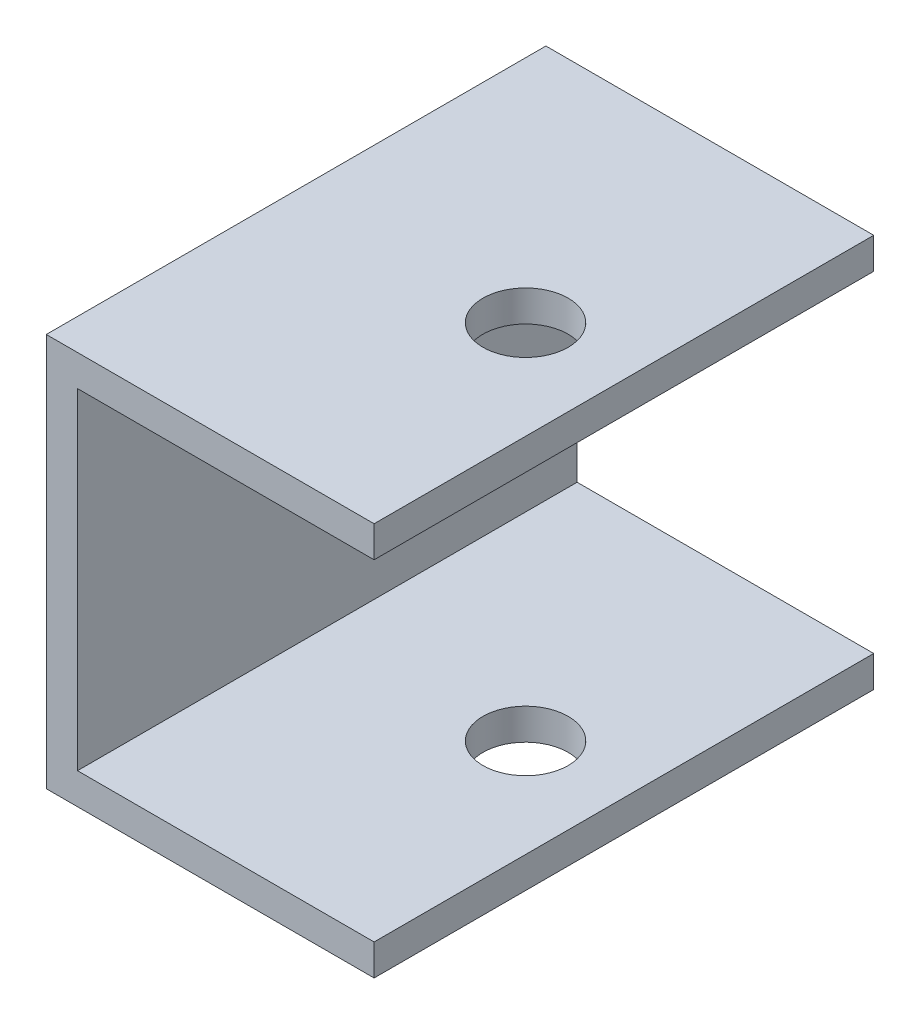
ISO-10303-21;
HEADER;
FILE_DESCRIPTION(('STEP AP214'),'2;1');
FILE_NAME('part.step','',(''),(''),'','','');
FILE_SCHEMA(('AUTOMOTIVE_DESIGN { 1 0 10303 214 1 1 1 1 }'));
ENDSEC;
DATA;
#1=APPLICATION_CONTEXT('core data for automotive mechanical design processes');
#2=APPLICATION_PROTOCOL_DEFINITION('international standard','automotive_design',2000,#1);
#3=PRODUCT_CONTEXT('',#1,'mechanical');
#4=PRODUCT('Part','Part','',(#3));
#5=PRODUCT_RELATED_PRODUCT_CATEGORY('part','',(#4));
#6=PRODUCT_DEFINITION_FORMATION('','',#4);
#7=PRODUCT_DEFINITION_CONTEXT('part definition',#1,'design');
#8=PRODUCT_DEFINITION('design','',#6,#7);
#9=PRODUCT_DEFINITION_SHAPE('','',#8);
#10=(LENGTH_UNIT() NAMED_UNIT(*) SI_UNIT(.MILLI.,.METRE.));
#11=(NAMED_UNIT(*) PLANE_ANGLE_UNIT() SI_UNIT($,.RADIAN.));
#12=(NAMED_UNIT(*) SI_UNIT($,.STERADIAN.) SOLID_ANGLE_UNIT());
#13=UNCERTAINTY_MEASURE_WITH_UNIT(LENGTH_MEASURE(1.E-05),#10,'distance_accuracy_value','');
#14=(GEOMETRIC_REPRESENTATION_CONTEXT(3) GLOBAL_UNCERTAINTY_ASSIGNED_CONTEXT((#13)) GLOBAL_UNIT_ASSIGNED_CONTEXT((#10,
#11,#12)) REPRESENTATION_CONTEXT('',''));
#15=CARTESIAN_POINT('',(0.,0.,0.));
#16=DIRECTION('',(0.,0.,1.));
#17=DIRECTION('',(1.,0.,0.));
#18=AXIS2_PLACEMENT_3D('',#15,#16,#17);
#19=CARTESIAN_POINT('',(45.2375,30.,38.1));
#20=DIRECTION('',(-1.,0.,0.));
#21=DIRECTION('',(0.,-1.,0.));
#22=AXIS2_PLACEMENT_3D('',#19,#20,#21);
#23=PLANE('',#22);
#24=DIRECTION('',(0.,1.,0.));
#25=VECTOR('',#24,1.);
#26=CARTESIAN_POINT('',(45.2375,30.,-38.1));
#27=LINE('',#26,#25);
#28=CARTESIAN_POINT('',(45.2375,25.2375,-38.1));
#29=VERTEX_POINT('',#28);
#30=CARTESIAN_POINT('',(45.2375,30.,-38.1));
#31=VERTEX_POINT('',#30);
#32=EDGE_CURVE('E142',#29,#31,#27,.T.);
#33=ORIENTED_EDGE('',*,*,#32,.T.);
#34=DIRECTION('',(0.,0.,-1.));
#35=VECTOR('',#34,1.);
#36=CARTESIAN_POINT('',(45.2375,30.,38.1));
#37=LINE('',#36,#35);
#38=CARTESIAN_POINT('',(45.2375,30.,38.1));
#39=VERTEX_POINT('',#38);
#40=EDGE_CURVE('E11',#39,#31,#37,.T.);
#41=ORIENTED_EDGE('',*,*,#40,.F.);
#42=DIRECTION('',(0.,1.,0.));
#43=VECTOR('',#42,1.);
#44=CARTESIAN_POINT('',(45.2375,30.,38.1));
#45=LINE('',#44,#43);
#46=CARTESIAN_POINT('',(45.2375,25.2375,38.1));
#47=VERTEX_POINT('',#46);
#48=EDGE_CURVE('E165',#47,#39,#45,.T.);
#49=ORIENTED_EDGE('',*,*,#48,.F.);
#50=DIRECTION('',(0.,0.,-1.));
#51=VECTOR('',#50,1.);
#52=CARTESIAN_POINT('',(45.2375,25.2375,38.1));
#53=LINE('',#52,#51);
#54=EDGE_CURVE('E138',#47,#29,#53,.T.);
#55=ORIENTED_EDGE('',*,*,#54,.T.);
#56=EDGE_LOOP('',(#33,#41,#49,#55));
#57=FACE_BOUND('',#56,.T.);
#58=ADVANCED_FACE('F39',(#57),#23,.F.);
#59=CARTESIAN_POINT('',(-4.7625,30.,38.1));
#60=DIRECTION('',(0.,-1.,0.));
#61=DIRECTION('',(0.,0.,-1.));
#62=AXIS2_PLACEMENT_3D('',#59,#60,#61);
#63=PLANE('',#62);
#64=CARTESIAN_POINT('',(30.2375,30.,0.));
#65=DIRECTION('',(0.,-1.,0.));
#66=DIRECTION('',(0.,0.,-1.));
#67=AXIS2_PLACEMENT_3D('',#64,#65,#66);
#68=CIRCLE('',#67,6.5);
#69=CARTESIAN_POINT('',(36.7375,30.,0.));
#70=VERTEX_POINT('',#69);
#71=EDGE_CURVE('E189',#70,#70,#68,.T.);
#72=ORIENTED_EDGE('',*,*,#71,.T.);
#73=EDGE_LOOP('',(#72));
#74=FACE_BOUND('',#73,.T.);
#75=DIRECTION('',(-1.,0.,0.));
#76=VECTOR('',#75,1.);
#77=CARTESIAN_POINT('',(-4.7625,30.,-38.1));
#78=LINE('',#77,#76);
#79=CARTESIAN_POINT('',(-4.7625,30.,-38.1));
#80=VERTEX_POINT('',#79);
#81=EDGE_CURVE('E146',#31,#80,#78,.T.);
#82=ORIENTED_EDGE('',*,*,#81,.T.);
#83=DIRECTION('',(0.,0.,-1.));
#84=VECTOR('',#83,1.);
#85=CARTESIAN_POINT('',(-4.7625,30.,38.1));
#86=LINE('',#85,#84);
#87=CARTESIAN_POINT('',(-4.7625,30.,38.1));
#88=VERTEX_POINT('',#87);
#89=EDGE_CURVE('E49',#88,#80,#86,.T.);
#90=ORIENTED_EDGE('',*,*,#89,.F.);
#91=DIRECTION('',(-1.,0.,0.));
#92=VECTOR('',#91,1.);
#93=CARTESIAN_POINT('',(-4.7625,30.,38.1));
#94=LINE('',#93,#92);
#95=EDGE_CURVE('E101',#39,#88,#94,.T.);
#96=ORIENTED_EDGE('',*,*,#95,.F.);
#97=ORIENTED_EDGE('',*,*,#40,.T.);
#98=EDGE_LOOP('',(#82,#90,#96,#97));
#99=FACE_BOUND('',#98,.T.);
#100=ADVANCED_FACE('F239',(#74,#99),#63,.F.);
#101=CARTESIAN_POINT('',(-4.7625,-30.,38.1));
#102=DIRECTION('',(1.,0.,0.));
#103=DIRECTION('',(0.,1.,0.));
#104=AXIS2_PLACEMENT_3D('',#101,#102,#103);
#105=PLANE('',#104);
#106=CARTESIAN_POINT('',(-4.7625,0.,0.));
#107=DIRECTION('',(-1.,0.,0.));
#108=DIRECTION('',(0.,-1.,0.));
#109=AXIS2_PLACEMENT_3D('',#106,#107,#108);
#110=CIRCLE('',#109,5.55625);
#111=CARTESIAN_POINT('',(-4.7625,-5.55625,0.));
#112=VERTEX_POINT('',#111);
#113=EDGE_CURVE('E184',#112,#112,#110,.T.);
#114=ORIENTED_EDGE('',*,*,#113,.F.);
#115=EDGE_LOOP('',(#114));
#116=FACE_BOUND('',#115,.T.);
#117=DIRECTION('',(0.,-1.,0.));
#118=VECTOR('',#117,1.);
#119=CARTESIAN_POINT('',(-4.7625,-30.,-38.1));
#120=LINE('',#119,#118);
#121=CARTESIAN_POINT('',(-4.7625,-30.,-38.1));
#122=VERTEX_POINT('',#121);
#123=EDGE_CURVE('E150',#80,#122,#120,.T.);
#124=ORIENTED_EDGE('',*,*,#123,.T.);
#125=DIRECTION('',(0.,0.,-1.));
#126=VECTOR('',#125,1.);
#127=CARTESIAN_POINT('',(-4.7625,-30.,38.1));
#128=LINE('',#127,#126);
#129=CARTESIAN_POINT('',(-4.7625,-30.,38.1));
#130=VERTEX_POINT('',#129);
#131=EDGE_CURVE('E176',#130,#122,#128,.T.);
#132=ORIENTED_EDGE('',*,*,#131,.F.);
#133=DIRECTION('',(0.,-1.,0.));
#134=VECTOR('',#133,1.);
#135=CARTESIAN_POINT('',(-4.7625,-30.,38.1));
#136=LINE('',#135,#134);
#137=EDGE_CURVE('E203',#88,#130,#136,.T.);
#138=ORIENTED_EDGE('',*,*,#137,.F.);
#139=ORIENTED_EDGE('',*,*,#89,.T.);
#140=EDGE_LOOP('',(#124,#132,#138,#139));
#141=FACE_BOUND('',#140,.T.);
#142=ADVANCED_FACE('F243',(#116,#141),#105,.F.);
#143=CARTESIAN_POINT('',(45.2375,-30.,38.1));
#144=DIRECTION('',(0.,1.,0.));
#145=DIRECTION('',(-1.,0.,0.));
#146=AXIS2_PLACEMENT_3D('',#143,#144,#145);
#147=PLANE('',#146);
#148=CARTESIAN_POINT('',(30.2375,-30.,0.));
#149=DIRECTION('',(0.,-1.,0.));
#150=DIRECTION('',(1.,0.,0.));
#151=AXIS2_PLACEMENT_3D('',#148,#149,#150);
#152=CIRCLE('',#151,6.5);
#153=CARTESIAN_POINT('',(36.7375,-30.,0.));
#154=VERTEX_POINT('',#153);
#155=EDGE_CURVE('E265',#154,#154,#152,.T.);
#156=ORIENTED_EDGE('',*,*,#155,.F.);
#157=EDGE_LOOP('',(#156));
#158=FACE_BOUND('',#157,.T.);
#159=DIRECTION('',(1.,0.,0.));
#160=VECTOR('',#159,1.);
#161=CARTESIAN_POINT('',(45.2375,-30.,-38.1));
#162=LINE('',#161,#160);
#163=CARTESIAN_POINT('',(45.2375,-30.,-38.1));
#164=VERTEX_POINT('',#163);
#165=EDGE_CURVE('E153',#122,#164,#162,.T.);
#166=ORIENTED_EDGE('',*,*,#165,.T.);
#167=DIRECTION('',(0.,0.,-1.));
#168=VECTOR('',#167,1.);
#169=CARTESIAN_POINT('',(45.2375,-30.,38.1));
#170=LINE('',#169,#168);
#171=CARTESIAN_POINT('',(45.2375,-30.,38.1));
#172=VERTEX_POINT('',#171);
#173=EDGE_CURVE('E172',#172,#164,#170,.T.);
#174=ORIENTED_EDGE('',*,*,#173,.F.);
#175=DIRECTION('',(1.,0.,0.));
#176=VECTOR('',#175,1.);
#177=CARTESIAN_POINT('',(45.2375,-30.,38.1));
#178=LINE('',#177,#176);
#179=EDGE_CURVE('E206',#130,#172,#178,.T.);
#180=ORIENTED_EDGE('',*,*,#179,.F.);
#181=ORIENTED_EDGE('',*,*,#131,.T.);
#182=EDGE_LOOP('',(#166,#174,#180,#181));
#183=FACE_BOUND('',#182,.T.);
#184=ADVANCED_FACE('F214',(#158,#183),#147,.F.);
#185=CARTESIAN_POINT('',(45.2375,-25.2375,38.1));
#186=DIRECTION('',(-1.,0.,0.));
#187=DIRECTION('',(0.,0.,1.));
#188=AXIS2_PLACEMENT_3D('',#185,#186,#187);
#189=PLANE('',#188);
#190=DIRECTION('',(0.,1.,0.));
#191=VECTOR('',#190,1.);
#192=CARTESIAN_POINT('',(45.2375,-25.2375,-38.1));
#193=LINE('',#192,#191);
#194=CARTESIAN_POINT('',(45.2375,-25.2375,-38.1));
#195=VERTEX_POINT('',#194);
#196=EDGE_CURVE('E156',#164,#195,#193,.T.);
#197=ORIENTED_EDGE('',*,*,#196,.T.);
#198=DIRECTION('',(0.,0.,-1.));
#199=VECTOR('',#198,1.);
#200=CARTESIAN_POINT('',(45.2375,-25.2375,38.1));
#201=LINE('',#200,#199);
#202=CARTESIAN_POINT('',(45.2375,-25.2375,38.1));
#203=VERTEX_POINT('',#202);
#204=EDGE_CURVE('E131',#203,#195,#201,.T.);
#205=ORIENTED_EDGE('',*,*,#204,.F.);
#206=DIRECTION('',(0.,1.,0.));
#207=VECTOR('',#206,1.);
#208=CARTESIAN_POINT('',(45.2375,-25.2375,38.1));
#209=LINE('',#208,#207);
#210=EDGE_CURVE('E120',#172,#203,#209,.T.);
#211=ORIENTED_EDGE('',*,*,#210,.F.);
#212=ORIENTED_EDGE('',*,*,#173,.T.);
#213=EDGE_LOOP('',(#197,#205,#211,#212));
#214=FACE_BOUND('',#213,.T.);
#215=ADVANCED_FACE('F218',(#214),#189,.F.);
#216=CARTESIAN_POINT('',(0.,-25.2375,38.1));
#217=DIRECTION('',(0.,-1.,0.));
#218=DIRECTION('',(1.,0.,0.));
#219=AXIS2_PLACEMENT_3D('',#216,#217,#218);
#220=PLANE('',#219);
#221=CARTESIAN_POINT('',(30.2375,-25.2375,0.));
#222=DIRECTION('',(0.,-1.,0.));
#223=DIRECTION('',(1.,0.,0.));
#224=AXIS2_PLACEMENT_3D('',#221,#222,#223);
#225=CIRCLE('',#224,6.5);
#226=CARTESIAN_POINT('',(36.7375,-25.2375,0.));
#227=VERTEX_POINT('',#226);
#228=EDGE_CURVE('E195',#227,#227,#225,.T.);
#229=ORIENTED_EDGE('',*,*,#228,.T.);
#230=EDGE_LOOP('',(#229));
#231=FACE_BOUND('',#230,.T.);
#232=DIRECTION('',(-1.,0.,0.));
#233=VECTOR('',#232,1.);
#234=CARTESIAN_POINT('',(0.,-25.2375,-38.1));
#235=LINE('',#234,#233);
#236=CARTESIAN_POINT('',(0.,-25.2375,-38.1));
#237=VERTEX_POINT('',#236);
#238=EDGE_CURVE('E129',#195,#237,#235,.T.);
#239=ORIENTED_EDGE('',*,*,#238,.T.);
#240=DIRECTION('',(0.,0.,-1.));
#241=VECTOR('',#240,1.);
#242=CARTESIAN_POINT('',(0.,-25.2375,38.1));
#243=LINE('',#242,#241);
#244=CARTESIAN_POINT('',(0.,-25.2375,38.1));
#245=VERTEX_POINT('',#244);
#246=EDGE_CURVE('E126',#245,#237,#243,.T.);
#247=ORIENTED_EDGE('',*,*,#246,.F.);
#248=DIRECTION('',(-1.,0.,0.));
#249=VECTOR('',#248,1.);
#250=CARTESIAN_POINT('',(0.,-25.2375,38.1));
#251=LINE('',#250,#249);
#252=EDGE_CURVE('E114',#203,#245,#251,.T.);
#253=ORIENTED_EDGE('',*,*,#252,.F.);
#254=ORIENTED_EDGE('',*,*,#204,.T.);
#255=EDGE_LOOP('',(#239,#247,#253,#254));
#256=FACE_BOUND('',#255,.T.);
#257=ADVANCED_FACE('F127',(#231,#256),#220,.F.);
#258=CARTESIAN_POINT('',(0.,25.2375,38.1));
#259=DIRECTION('',(-1.,0.,0.));
#260=DIRECTION('',(0.,-1.,0.));
#261=AXIS2_PLACEMENT_3D('',#258,#259,#260);
#262=PLANE('',#261);
#263=CARTESIAN_POINT('',(0.,0.,0.));
#264=DIRECTION('',(-1.,0.,0.));
#265=DIRECTION('',(0.,-1.,0.));
#266=AXIS2_PLACEMENT_3D('',#263,#264,#265);
#267=CIRCLE('',#266,5.55625);
#268=CARTESIAN_POINT('',(0.,-5.55625,0.));
#269=VERTEX_POINT('',#268);
#270=EDGE_CURVE('E147',#269,#269,#267,.T.);
#271=ORIENTED_EDGE('',*,*,#270,.T.);
#272=EDGE_LOOP('',(#271));
#273=FACE_BOUND('',#272,.T.);
#274=DIRECTION('',(0.,1.,0.));
#275=VECTOR('',#274,1.);
#276=CARTESIAN_POINT('',(0.,25.2375,-38.1));
#277=LINE('',#276,#275);
#278=CARTESIAN_POINT('',(0.,25.2375,-38.1));
#279=VERTEX_POINT('',#278);
#280=EDGE_CURVE('E87',#237,#279,#277,.T.);
#281=ORIENTED_EDGE('',*,*,#280,.T.);
#282=DIRECTION('',(0.,0.,-1.));
#283=VECTOR('',#282,1.);
#284=CARTESIAN_POINT('',(0.,25.2375,38.1));
#285=LINE('',#284,#283);
#286=CARTESIAN_POINT('',(0.,25.2375,38.1));
#287=VERTEX_POINT('',#286);
#288=EDGE_CURVE('E132',#287,#279,#285,.T.);
#289=ORIENTED_EDGE('',*,*,#288,.F.);
#290=DIRECTION('',(0.,1.,0.));
#291=VECTOR('',#290,1.);
#292=CARTESIAN_POINT('',(0.,25.2375,38.1));
#293=LINE('',#292,#291);
#294=EDGE_CURVE('E118',#245,#287,#293,.T.);
#295=ORIENTED_EDGE('',*,*,#294,.F.);
#296=ORIENTED_EDGE('',*,*,#246,.T.);
#297=EDGE_LOOP('',(#281,#289,#295,#296));
#298=FACE_BOUND('',#297,.T.);
#299=ADVANCED_FACE('F134',(#273,#298),#262,.F.);
#300=CARTESIAN_POINT('',(45.2375,25.2375,38.1));
#301=DIRECTION('',(0.,1.,0.));
#302=DIRECTION('',(-1.,0.,0.));
#303=AXIS2_PLACEMENT_3D('',#300,#301,#302);
#304=PLANE('',#303);
#305=CARTESIAN_POINT('',(30.2375,25.2375,0.));
#306=DIRECTION('',(0.,1.,0.));
#307=DIRECTION('',(-1.,0.,0.));
#308=AXIS2_PLACEMENT_3D('',#305,#306,#307);
#309=CIRCLE('',#308,6.5);
#310=CARTESIAN_POINT('',(36.7375,25.2375,0.));
#311=VERTEX_POINT('',#310);
#312=EDGE_CURVE('E42',#311,#311,#309,.T.);
#313=ORIENTED_EDGE('',*,*,#312,.T.);
#314=EDGE_LOOP('',(#313));
#315=FACE_BOUND('',#314,.T.);
#316=DIRECTION('',(1.,0.,0.));
#317=VECTOR('',#316,1.);
#318=CARTESIAN_POINT('',(45.2375,25.2375,-38.1));
#319=LINE('',#318,#317);
#320=EDGE_CURVE('E93',#279,#29,#319,.T.);
#321=ORIENTED_EDGE('',*,*,#320,.T.);
#322=ORIENTED_EDGE('',*,*,#54,.F.);
#323=DIRECTION('',(1.,0.,0.));
#324=VECTOR('',#323,1.);
#325=CARTESIAN_POINT('',(45.2375,25.2375,38.1));
#326=LINE('',#325,#324);
#327=EDGE_CURVE('E58',#287,#47,#326,.T.);
#328=ORIENTED_EDGE('',*,*,#327,.F.);
#329=ORIENTED_EDGE('',*,*,#288,.T.);
#330=EDGE_LOOP('',(#321,#322,#328,#329));
#331=FACE_BOUND('',#330,.T.);
#332=ADVANCED_FACE('F226',(#315,#331),#304,.F.);
#333=CARTESIAN_POINT('',(0.,0.,38.1));
#334=DIRECTION('',(0.,0.,-1.));
#335=DIRECTION('',(-1.,0.,0.));
#336=AXIS2_PLACEMENT_3D('',#333,#334,#335);
#337=PLANE('',#336);
#338=ORIENTED_EDGE('',*,*,#48,.T.);
#339=ORIENTED_EDGE('',*,*,#95,.T.);
#340=ORIENTED_EDGE('',*,*,#137,.T.);
#341=ORIENTED_EDGE('',*,*,#179,.T.);
#342=ORIENTED_EDGE('',*,*,#210,.T.);
#343=ORIENTED_EDGE('',*,*,#252,.T.);
#344=ORIENTED_EDGE('',*,*,#294,.T.);
#345=ORIENTED_EDGE('',*,*,#327,.T.);
#346=EDGE_LOOP('',(#338,#339,#340,#341,#342,#343,#344,#345));
#347=FACE_BOUND('',#346,.T.);
#348=ADVANCED_FACE('F116',(#347),#337,.F.);
#349=CARTESIAN_POINT('',(0.,0.,-38.1));
#350=DIRECTION('',(0.,0.,-1.));
#351=DIRECTION('',(-1.,0.,0.));
#352=AXIS2_PLACEMENT_3D('',#349,#350,#351);
#353=PLANE('',#352);
#354=ORIENTED_EDGE('',*,*,#32,.F.);
#355=ORIENTED_EDGE('',*,*,#320,.F.);
#356=ORIENTED_EDGE('',*,*,#280,.F.);
#357=ORIENTED_EDGE('',*,*,#238,.F.);
#358=ORIENTED_EDGE('',*,*,#196,.F.);
#359=ORIENTED_EDGE('',*,*,#165,.F.);
#360=ORIENTED_EDGE('',*,*,#123,.F.);
#361=ORIENTED_EDGE('',*,*,#81,.F.);
#362=EDGE_LOOP('',(#354,#355,#356,#357,#358,#359,#360,#361));
#363=FACE_BOUND('',#362,.T.);
#364=ADVANCED_FACE('F221',(#363),#353,.T.);
#365=CARTESIAN_POINT('',(0.237499999999997,0.,0.));
#366=DIRECTION('',(-1.,0.,0.));
#367=DIRECTION('',(0.,-1.,0.));
#368=AXIS2_PLACEMENT_3D('',#365,#366,#367);
#369=CYLINDRICAL_SURFACE('',#368,5.55625);
#370=ORIENTED_EDGE('',*,*,#113,.T.);
#371=EDGE_LOOP('',(#370));
#372=FACE_BOUND('',#371,.T.);
#373=ORIENTED_EDGE('',*,*,#270,.F.);
#374=EDGE_LOOP('',(#373));
#375=FACE_BOUND('',#374,.T.);
#376=ADVANCED_FACE('F278',(#372,#375),#369,.F.);
#377=CARTESIAN_POINT('',(30.2375,40.,0.));
#378=DIRECTION('',(0.,-1.,0.));
#379=DIRECTION('',(1.,0.,0.));
#380=AXIS2_PLACEMENT_3D('',#377,#378,#379);
#381=CYLINDRICAL_SURFACE('',#380,6.5);
#382=CARTESIAN_POINT('',(36.7375,25.2375,0.));
#383=CARTESIAN_POINT('',(36.7375,25.287109375,0.));
#384=CARTESIAN_POINT('',(36.7375,25.33671875,0.));
#385=CARTESIAN_POINT('',(36.7375,25.4359375,0.));
#386=CARTESIAN_POINT('',(36.7375,25.485546875,0.));
#387=CARTESIAN_POINT('',(36.7375,25.584765625,0.));
#388=CARTESIAN_POINT('',(36.7375,25.634375,0.));
#389=CARTESIAN_POINT('',(36.7375,25.73359375,0.));
#390=CARTESIAN_POINT('',(36.7375,25.783203125,0.));
#391=CARTESIAN_POINT('',(36.7375,25.882421875,0.));
#392=CARTESIAN_POINT('',(36.7375,25.93203125,0.));
#393=CARTESIAN_POINT('',(36.7375,26.03125,0.));
#394=CARTESIAN_POINT('',(36.7375,26.080859375,0.));
#395=CARTESIAN_POINT('',(36.7375,26.180078125,0.));
#396=CARTESIAN_POINT('',(36.7375,26.2296875,0.));
#397=CARTESIAN_POINT('',(36.7375,26.32890625,0.));
#398=CARTESIAN_POINT('',(36.7375,26.378515625,0.));
#399=CARTESIAN_POINT('',(36.7375,26.477734375,0.));
#400=CARTESIAN_POINT('',(36.7375,26.52734375,0.));
#401=CARTESIAN_POINT('',(36.7375,26.6265625,0.));
#402=CARTESIAN_POINT('',(36.7375,26.676171875,0.));
#403=CARTESIAN_POINT('',(36.7375,26.775390625,0.));
#404=CARTESIAN_POINT('',(36.7375,26.825,0.));
#405=CARTESIAN_POINT('',(36.7375,26.92421875,0.));
#406=CARTESIAN_POINT('',(36.7375,26.973828125,0.));
#407=CARTESIAN_POINT('',(36.7375,27.073046875,0.));
#408=CARTESIAN_POINT('',(36.7375,27.12265625,0.));
#409=CARTESIAN_POINT('',(36.7375,27.221875,0.));
#410=CARTESIAN_POINT('',(36.7375,27.271484375,0.));
#411=CARTESIAN_POINT('',(36.7375,27.370703125,0.));
#412=CARTESIAN_POINT('',(36.7375,27.4203125,0.));
#413=CARTESIAN_POINT('',(36.7375,27.51953125,0.));
#414=CARTESIAN_POINT('',(36.7375,27.569140625,0.));
#415=CARTESIAN_POINT('',(36.7375,27.668359375,0.));
#416=CARTESIAN_POINT('',(36.7375,27.71796875,0.));
#417=CARTESIAN_POINT('',(36.7375,27.8171875,0.));
#418=CARTESIAN_POINT('',(36.7375,27.866796875,0.));
#419=CARTESIAN_POINT('',(36.7375,27.966015625,0.));
#420=CARTESIAN_POINT('',(36.7375,28.015625,0.));
#421=CARTESIAN_POINT('',(36.7375,28.11484375,0.));
#422=CARTESIAN_POINT('',(36.7375,28.164453125,0.));
#423=CARTESIAN_POINT('',(36.7375,28.263671875,0.));
#424=CARTESIAN_POINT('',(36.7375,28.31328125,0.));
#425=CARTESIAN_POINT('',(36.7375,28.4125,0.));
#426=CARTESIAN_POINT('',(36.7375,28.462109375,0.));
#427=CARTESIAN_POINT('',(36.7375,28.561328125,0.));
#428=CARTESIAN_POINT('',(36.7375,28.6109375,0.));
#429=CARTESIAN_POINT('',(36.7375,28.71015625,0.));
#430=CARTESIAN_POINT('',(36.7375,28.759765625,0.));
#431=CARTESIAN_POINT('',(36.7375,28.858984375,0.));
#432=CARTESIAN_POINT('',(36.7375,28.90859375,0.));
#433=CARTESIAN_POINT('',(36.7375,29.0078125,0.));
#434=CARTESIAN_POINT('',(36.7375,29.057421875,0.));
#435=CARTESIAN_POINT('',(36.7375,29.156640625,0.));
#436=CARTESIAN_POINT('',(36.7375,29.20625,0.));
#437=CARTESIAN_POINT('',(36.7375,29.30546875,0.));
#438=CARTESIAN_POINT('',(36.7375,29.355078125,0.));
#439=CARTESIAN_POINT('',(36.7375,29.454296875,0.));
#440=CARTESIAN_POINT('',(36.7375,29.50390625,0.));
#441=CARTESIAN_POINT('',(36.7375,29.603125,0.));
#442=CARTESIAN_POINT('',(36.7375,29.652734375,0.));
#443=CARTESIAN_POINT('',(36.7375,29.751953125,0.));
#444=CARTESIAN_POINT('',(36.7375,29.8015625,0.));
#445=CARTESIAN_POINT('',(36.7375,29.90078125,0.));
#446=CARTESIAN_POINT('',(36.7375,29.950390625,0.));
#447=CARTESIAN_POINT('',(36.7375,30.,0.));
#448=B_SPLINE_CURVE_WITH_KNOTS('',3,(#382,#383,#384,#385,#386,#387,#388,#389,#390,#391,#392,
#393,#394,#395,#396,#397,#398,#399,#400,#401,#402,#403,#404,#405,#406,#407,#408,#409,#410,#411,
#412,#413,#414,#415,#416,#417,#418,#419,#420,#421,#422,#423,#424,#425,#426,#427,#428,#429,#430,
#431,#432,#433,#434,#435,#436,#437,#438,#439,#440,#441,#442,#443,#444,#445,#446,#447),
.UNSPECIFIED.,.F.,.F.,(4,2,2,2,2,2,2,2,2,2,2,2,2,2,2,2,2,2,2,2,2,2,2,2,2,2,2,2,2,2,2,2,4),(0.,
0.148828125,0.29765625,0.446484375,0.5953125,0.744140624999997,0.892968749999997,1.041796875,
1.190625,1.339453125,1.48828125,1.637109375,1.7859375,1.934765625,2.08359375,2.232421875,
2.38125,2.530078125,2.67890625,2.827734375,2.9765625,3.125390625,3.27421875,3.423046875,
3.571875,3.720703125,3.86953125,4.018359375,4.1671875,4.316015625,4.46484375,4.613671875,
4.7625),.UNSPECIFIED.);
#449=EDGE_CURVE('BSEAM273',#311,#70,#448,.T.);
#450=ORIENTED_EDGE('',*,*,#312,.F.);
#451=ORIENTED_EDGE('',*,*,#71,.F.);
#452=ORIENTED_EDGE('',*,*,#449,.T.);
#453=ORIENTED_EDGE('',*,*,#449,.F.);
#454=EDGE_LOOP('',(#450,#452,#451,#453));
#455=FACE_BOUND('',#454,.T.);
#456=ADVANCED_FACE('F273',(#455),#381,.F.);
#457=ORIENTED_EDGE('',*,*,#155,.T.);
#458=EDGE_LOOP('',(#457));
#459=FACE_BOUND('',#458,.T.);
#460=ORIENTED_EDGE('',*,*,#228,.F.);
#461=EDGE_LOOP('',(#460));
#462=FACE_BOUND('',#461,.T.);
#463=ADVANCED_FACE('F271',(#459,#462),#381,.F.);
#464=CLOSED_SHELL('',(#58,#100,#142,#184,#215,#257,#299,#332,#348,#364,#376,#456,#463));
#465=MANIFOLD_SOLID_BREP('B2',#464);
#466=ADVANCED_BREP_SHAPE_REPRESENTATION('',(#18,#465),#14);
#467=SHAPE_DEFINITION_REPRESENTATION(#9,#466);
ENDSEC;
END-ISO-10303-21;
